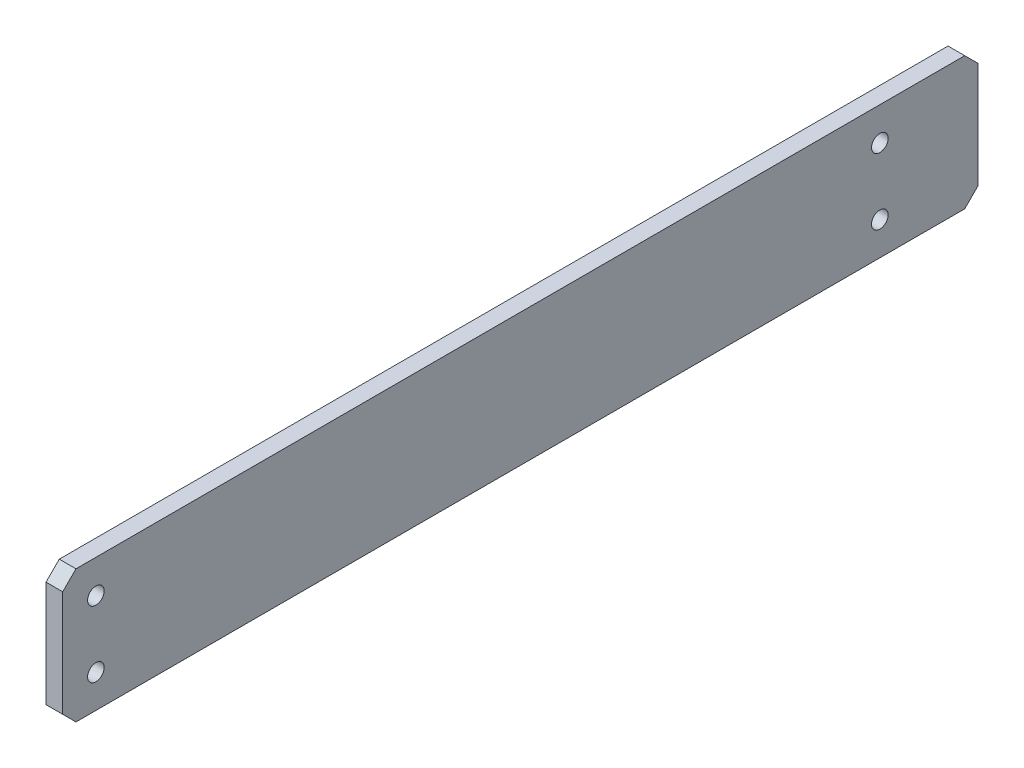
ISO-10303-21;
HEADER;
FILE_DESCRIPTION(('STEP AP214'),'2;1');
FILE_NAME('part.step','',(''),(''),'','','');
FILE_SCHEMA(('AUTOMOTIVE_DESIGN { 1 0 10303 214 1 1 1 1 }'));
ENDSEC;
DATA;
#1=APPLICATION_CONTEXT('core data for automotive mechanical design processes');
#2=APPLICATION_PROTOCOL_DEFINITION('international standard','automotive_design',2000,#1);
#3=PRODUCT_CONTEXT('',#1,'mechanical');
#4=PRODUCT('Part','Part','',(#3));
#5=PRODUCT_RELATED_PRODUCT_CATEGORY('part','',(#4));
#6=PRODUCT_DEFINITION_FORMATION('','',#4);
#7=PRODUCT_DEFINITION_CONTEXT('part definition',#1,'design');
#8=PRODUCT_DEFINITION('design','',#6,#7);
#9=PRODUCT_DEFINITION_SHAPE('','',#8);
#10=(LENGTH_UNIT() NAMED_UNIT(*) SI_UNIT(.MILLI.,.METRE.));
#11=(NAMED_UNIT(*) PLANE_ANGLE_UNIT() SI_UNIT($,.RADIAN.));
#12=(NAMED_UNIT(*) SI_UNIT($,.STERADIAN.) SOLID_ANGLE_UNIT());
#13=UNCERTAINTY_MEASURE_WITH_UNIT(LENGTH_MEASURE(1.E-05),#10,'distance_accuracy_value','');
#14=(GEOMETRIC_REPRESENTATION_CONTEXT(3) GLOBAL_UNCERTAINTY_ASSIGNED_CONTEXT((#13)) GLOBAL_UNIT_ASSIGNED_CONTEXT((#10,
#11,#12)) REPRESENTATION_CONTEXT('',''));
#15=CARTESIAN_POINT('',(0.,0.,0.));
#16=DIRECTION('',(0.,0.,1.));
#17=DIRECTION('',(1.,0.,0.));
#18=AXIS2_PLACEMENT_3D('',#15,#16,#17);
#19=CARTESIAN_POINT('',(5.588,0.,1.9558));
#20=DIRECTION('',(0.,-1.,0.));
#21=DIRECTION('',(-1.,0.,0.));
#22=AXIS2_PLACEMENT_3D('',#19,#20,#21);
#23=PLANE('',#22);
#24=DIRECTION('',(0.,0.,-1.));
#25=VECTOR('',#24,1.);
#26=CARTESIAN_POINT('',(7.9502,0.,9.906));
#27=LINE('',#26,#25);
#28=CARTESIAN_POINT('',(7.9502,0.,8.63599999999999));
#29=VERTEX_POINT('',#28);
#30=CARTESIAN_POINT('',(7.9502,0.,-76.454));
#31=VERTEX_POINT('',#30);
#32=EDGE_CURVE('E191',#29,#31,#27,.T.);
#33=ORIENTED_EDGE('',*,*,#32,.F.);
#34=DIRECTION('',(-1.,0.,0.));
#35=VECTOR('',#34,1.);
#36=CARTESIAN_POINT('',(5.588,0.,8.63599999999999));
#37=LINE('',#36,#35);
#38=CARTESIAN_POINT('',(6.35,0.,8.63599999999999));
#39=VERTEX_POINT('',#38);
#40=EDGE_CURVE('E202',#29,#39,#37,.T.);
#41=ORIENTED_EDGE('',*,*,#40,.T.);
#42=DIRECTION('',(0.,0.,-1.));
#43=VECTOR('',#42,1.);
#44=CARTESIAN_POINT('',(6.35,0.,9.906));
#45=LINE('',#44,#43);
#46=CARTESIAN_POINT('',(6.35,0.,-76.454));
#47=VERTEX_POINT('',#46);
#48=EDGE_CURVE('E176',#39,#47,#45,.T.);
#49=ORIENTED_EDGE('',*,*,#48,.T.);
#50=DIRECTION('',(1.,0.,0.));
#51=VECTOR('',#50,1.);
#52=CARTESIAN_POINT('',(5.588,0.,-76.454));
#53=LINE('',#52,#51);
#54=EDGE_CURVE('E189',#47,#31,#53,.T.);
#55=ORIENTED_EDGE('',*,*,#54,.T.);
#56=EDGE_LOOP('',(#33,#41,#49,#55));
#57=FACE_BOUND('',#56,.T.);
#58=ADVANCED_FACE('F49',(#57),#23,.T.);
#59=CARTESIAN_POINT('',(6.35,12.7,0.));
#60=DIRECTION('',(-1.,0.,0.));
#61=DIRECTION('',(0.,0.,1.));
#62=AXIS2_PLACEMENT_3D('',#59,#60,#61);
#63=PLANE('',#62);
#64=CARTESIAN_POINT('',(6.35,9.525,6.731));
#65=DIRECTION('',(-1.,0.,0.));
#66=DIRECTION('',(0.,0.,1.));
#67=AXIS2_PLACEMENT_3D('',#64,#65,#66);
#68=CIRCLE('',#67,0.793749999999999);
#69=CARTESIAN_POINT('',(6.35,9.525,7.52475));
#70=VERTEX_POINT('',#69);
#71=EDGE_CURVE('E177',#70,#70,#68,.T.);
#72=ORIENTED_EDGE('',*,*,#71,.F.);
#73=EDGE_LOOP('',(#72));
#74=FACE_BOUND('',#73,.T.);
#75=CARTESIAN_POINT('',(6.35,3.175,6.731));
#76=DIRECTION('',(-1.,0.,0.));
#77=DIRECTION('',(0.,0.,1.));
#78=AXIS2_PLACEMENT_3D('',#75,#76,#77);
#79=CIRCLE('',#78,0.793750000000001);
#80=CARTESIAN_POINT('',(6.35,3.175,7.52475));
#81=VERTEX_POINT('',#80);
#82=EDGE_CURVE('E181',#81,#81,#79,.T.);
#83=ORIENTED_EDGE('',*,*,#82,.F.);
#84=EDGE_LOOP('',(#83));
#85=FACE_BOUND('',#84,.T.);
#86=DIRECTION('',(0.,-1.,0.));
#87=VECTOR('',#86,1.);
#88=CARTESIAN_POINT('',(6.35,12.7,9.906));
#89=LINE('',#88,#87);
#90=CARTESIAN_POINT('',(6.35,11.43,9.906));
#91=VERTEX_POINT('',#90);
#92=CARTESIAN_POINT('',(6.35,1.27000000000001,9.906));
#93=VERTEX_POINT('',#92);
#94=EDGE_CURVE('E199',#91,#93,#89,.T.);
#95=ORIENTED_EDGE('',*,*,#94,.F.);
#96=DIRECTION('',(0.,0.707106781186548,-0.707106781186547));
#97=VECTOR('',#96,1.);
#98=CARTESIAN_POINT('',(6.35,12.065,9.271));
#99=LINE('',#98,#97);
#100=CARTESIAN_POINT('',(6.35,12.7,8.63599999999999));
#101=VERTEX_POINT('',#100);
#102=EDGE_CURVE('E72',#91,#101,#99,.T.);
#103=ORIENTED_EDGE('',*,*,#102,.T.);
#104=DIRECTION('',(0.,0.,-1.));
#105=VECTOR('',#104,1.);
#106=CARTESIAN_POINT('',(6.35,12.7,9.906));
#107=LINE('',#106,#105);
#108=CARTESIAN_POINT('',(6.35,12.7,-76.454));
#109=VERTEX_POINT('',#108);
#110=EDGE_CURVE('E121',#101,#109,#107,.T.);
#111=ORIENTED_EDGE('',*,*,#110,.T.);
#112=DIRECTION('',(0.,0.707106781186549,0.707106781186547));
#113=VECTOR('',#112,1.);
#114=CARTESIAN_POINT('',(6.35,50.927,-38.2270000000001));
#115=LINE('',#114,#113);
#116=CARTESIAN_POINT('',(6.35,11.43,-77.724));
#117=VERTEX_POINT('',#116);
#118=EDGE_CURVE('E137',#109,#117,#115,.F.);
#119=ORIENTED_EDGE('',*,*,#118,.T.);
#120=DIRECTION('',(0.,-1.,0.));
#121=VECTOR('',#120,1.);
#122=CARTESIAN_POINT('',(6.35,12.7,-77.724));
#123=LINE('',#122,#121);
#124=CARTESIAN_POINT('',(6.35,1.27000000000001,-77.724));
#125=VERTEX_POINT('',#124);
#126=EDGE_CURVE('E147',#117,#125,#123,.T.);
#127=ORIENTED_EDGE('',*,*,#126,.T.);
#128=DIRECTION('',(0.,0.707106781186549,-0.707106781186547));
#129=VECTOR('',#128,1.);
#130=CARTESIAN_POINT('',(6.35,-31.877,-44.5770000000001));
#131=LINE('',#130,#129);
#132=EDGE_CURVE('E140',#125,#47,#131,.F.);
#133=ORIENTED_EDGE('',*,*,#132,.T.);
#134=ORIENTED_EDGE('',*,*,#48,.F.);
#135=DIRECTION('',(0.,-0.707106781186548,-0.707106781186548));
#136=VECTOR('',#135,1.);
#137=CARTESIAN_POINT('',(6.35,6.985,15.621));
#138=LINE('',#137,#136);
#139=EDGE_CURVE('E206',#39,#93,#138,.F.);
#140=ORIENTED_EDGE('',*,*,#139,.T.);
#141=EDGE_LOOP('',(#95,#103,#111,#119,#127,#133,#134,#140));
#142=FACE_BOUND('',#141,.T.);
#143=CARTESIAN_POINT('',(6.35,9.525,-68.326));
#144=DIRECTION('',(-1.,0.,0.));
#145=DIRECTION('',(0.,0.,1.));
#146=AXIS2_PLACEMENT_3D('',#143,#144,#145);
#147=CIRCLE('',#146,0.793749999999993);
#148=CARTESIAN_POINT('',(6.35,9.525,-67.53225));
#149=VERTEX_POINT('',#148);
#150=EDGE_CURVE('E155',#149,#149,#147,.T.);
#151=ORIENTED_EDGE('',*,*,#150,.F.);
#152=EDGE_LOOP('',(#151));
#153=FACE_BOUND('',#152,.T.);
#154=CARTESIAN_POINT('',(6.35,3.175,-68.326));
#155=DIRECTION('',(-1.,0.,0.));
#156=DIRECTION('',(0.,0.,1.));
#157=AXIS2_PLACEMENT_3D('',#154,#155,#156);
#158=CIRCLE('',#157,0.793749999999993);
#159=CARTESIAN_POINT('',(6.35,3.175,-67.53225));
#160=VERTEX_POINT('',#159);
#161=EDGE_CURVE('E159',#160,#160,#158,.T.);
#162=ORIENTED_EDGE('',*,*,#161,.F.);
#163=EDGE_LOOP('',(#162));
#164=FACE_BOUND('',#163,.T.);
#165=ADVANCED_FACE('F51',(#74,#85,#142,#153,#164),#63,.T.);
#166=CARTESIAN_POINT('',(7.9502,12.7,9.906));
#167=DIRECTION('',(0.,0.,1.));
#168=DIRECTION('',(1.,0.,0.));
#169=AXIS2_PLACEMENT_3D('',#166,#167,#168);
#170=PLANE('',#169);
#171=DIRECTION('',(0.,-1.,0.));
#172=VECTOR('',#171,1.);
#173=CARTESIAN_POINT('',(7.9502,12.7,9.906));
#174=LINE('',#173,#172);
#175=CARTESIAN_POINT('',(7.9502,11.43,9.906));
#176=VERTEX_POINT('',#175);
#177=CARTESIAN_POINT('',(7.9502,1.27000000000001,9.906));
#178=VERTEX_POINT('',#177);
#179=EDGE_CURVE('E120',#176,#178,#174,.T.);
#180=ORIENTED_EDGE('',*,*,#179,.F.);
#181=DIRECTION('',(-1.,0.,0.));
#182=VECTOR('',#181,1.);
#183=CARTESIAN_POINT('',(6.35,11.43,9.906));
#184=LINE('',#183,#182);
#185=EDGE_CURVE('E217',#176,#91,#184,.T.);
#186=ORIENTED_EDGE('',*,*,#185,.T.);
#187=ORIENTED_EDGE('',*,*,#94,.T.);
#188=DIRECTION('',(1.,0.,0.));
#189=VECTOR('',#188,1.);
#190=CARTESIAN_POINT('',(7.9502,1.27000000000001,9.906));
#191=LINE('',#190,#189);
#192=EDGE_CURVE('E210',#93,#178,#191,.T.);
#193=ORIENTED_EDGE('',*,*,#192,.T.);
#194=EDGE_LOOP('',(#180,#186,#187,#193));
#195=FACE_BOUND('',#194,.T.);
#196=ADVANCED_FACE('F241',(#195),#170,.T.);
#197=CARTESIAN_POINT('',(7.9502,12.7,9.906));
#198=DIRECTION('',(-1.,0.,0.));
#199=DIRECTION('',(0.,0.,1.));
#200=AXIS2_PLACEMENT_3D('',#197,#198,#199);
#201=PLANE('',#200);
#202=CARTESIAN_POINT('',(7.9502,9.525,6.731));
#203=DIRECTION('',(-1.,0.,0.));
#204=DIRECTION('',(0.,0.,1.));
#205=AXIS2_PLACEMENT_3D('',#202,#203,#204);
#206=CIRCLE('',#205,0.793749999999999);
#207=CARTESIAN_POINT('',(7.9502,9.525,7.52475));
#208=VERTEX_POINT('',#207);
#209=EDGE_CURVE('E172',#208,#208,#206,.T.);
#210=ORIENTED_EDGE('',*,*,#209,.T.);
#211=EDGE_LOOP('',(#210));
#212=FACE_BOUND('',#211,.T.);
#213=CARTESIAN_POINT('',(7.9502,3.175,6.731));
#214=DIRECTION('',(-1.,0.,0.));
#215=DIRECTION('',(0.,0.,1.));
#216=AXIS2_PLACEMENT_3D('',#213,#214,#215);
#217=CIRCLE('',#216,0.793750000000001);
#218=CARTESIAN_POINT('',(7.9502,3.175,7.52475));
#219=VERTEX_POINT('',#218);
#220=EDGE_CURVE('E185',#219,#219,#217,.T.);
#221=ORIENTED_EDGE('',*,*,#220,.T.);
#222=EDGE_LOOP('',(#221));
#223=FACE_BOUND('',#222,.T.);
#224=DIRECTION('',(0.,0.,-1.));
#225=VECTOR('',#224,1.);
#226=CARTESIAN_POINT('',(7.9502,12.7,9.906));
#227=LINE('',#226,#225);
#228=CARTESIAN_POINT('',(7.9502,12.7,8.63599999999999));
#229=VERTEX_POINT('',#228);
#230=CARTESIAN_POINT('',(7.9502,12.7,-76.454));
#231=VERTEX_POINT('',#230);
#232=EDGE_CURVE('E111',#229,#231,#227,.T.);
#233=ORIENTED_EDGE('',*,*,#232,.F.);
#234=DIRECTION('',(0.,-0.707106781186548,0.707106781186547));
#235=VECTOR('',#234,1.);
#236=CARTESIAN_POINT('',(7.9502,11.43,9.906));
#237=LINE('',#236,#235);
#238=EDGE_CURVE('E12',#229,#176,#237,.T.);
#239=ORIENTED_EDGE('',*,*,#238,.T.);
#240=ORIENTED_EDGE('',*,*,#179,.T.);
#241=DIRECTION('',(0.,0.707106781186548,0.707106781186548));
#242=VECTOR('',#241,1.);
#243=CARTESIAN_POINT('',(7.9502,0.,8.63599999999999));
#244=LINE('',#243,#242);
#245=EDGE_CURVE('E214',#178,#29,#244,.F.);
#246=ORIENTED_EDGE('',*,*,#245,.T.);
#247=ORIENTED_EDGE('',*,*,#32,.T.);
#248=DIRECTION('',(0.,-0.707106781186549,0.707106781186547));
#249=VECTOR('',#248,1.);
#250=CARTESIAN_POINT('',(7.9502,0.,-76.454));
#251=LINE('',#250,#249);
#252=CARTESIAN_POINT('',(7.9502,1.27000000000001,-77.724));
#253=VERTEX_POINT('',#252);
#254=EDGE_CURVE('E133',#31,#253,#251,.F.);
#255=ORIENTED_EDGE('',*,*,#254,.T.);
#256=DIRECTION('',(0.,-1.,0.));
#257=VECTOR('',#256,1.);
#258=CARTESIAN_POINT('',(7.9502,12.7,-77.724));
#259=LINE('',#258,#257);
#260=CARTESIAN_POINT('',(7.9502,11.43,-77.724));
#261=VERTEX_POINT('',#260);
#262=EDGE_CURVE('E128',#261,#253,#259,.T.);
#263=ORIENTED_EDGE('',*,*,#262,.F.);
#264=DIRECTION('',(0.,-0.707106781186549,-0.707106781186547));
#265=VECTOR('',#264,1.);
#266=CARTESIAN_POINT('',(7.9502,11.43,-77.724));
#267=LINE('',#266,#265);
#268=EDGE_CURVE('E124',#261,#231,#267,.F.);
#269=ORIENTED_EDGE('',*,*,#268,.T.);
#270=EDGE_LOOP('',(#233,#239,#240,#246,#247,#255,#263,#269));
#271=FACE_BOUND('',#270,.T.);
#272=CARTESIAN_POINT('',(7.9502,9.525,-68.326));
#273=DIRECTION('',(-1.,0.,0.));
#274=DIRECTION('',(0.,0.,1.));
#275=AXIS2_PLACEMENT_3D('',#272,#273,#274);
#276=CIRCLE('',#275,0.793749999999993);
#277=CARTESIAN_POINT('',(7.9502,9.525,-67.53225));
#278=VERTEX_POINT('',#277);
#279=EDGE_CURVE('E139',#278,#278,#276,.T.);
#280=ORIENTED_EDGE('',*,*,#279,.T.);
#281=EDGE_LOOP('',(#280));
#282=FACE_BOUND('',#281,.T.);
#283=CARTESIAN_POINT('',(7.9502,3.175,-68.326));
#284=DIRECTION('',(-1.,0.,0.));
#285=DIRECTION('',(0.,0.,1.));
#286=AXIS2_PLACEMENT_3D('',#283,#284,#285);
#287=CIRCLE('',#286,0.793749999999993);
#288=CARTESIAN_POINT('',(7.9502,3.175,-67.53225));
#289=VERTEX_POINT('',#288);
#290=EDGE_CURVE('E134',#289,#289,#287,.T.);
#291=ORIENTED_EDGE('',*,*,#290,.T.);
#292=EDGE_LOOP('',(#291));
#293=FACE_BOUND('',#292,.T.);
#294=ADVANCED_FACE('F125',(#212,#223,#271,#282,#293),#201,.F.);
#295=CARTESIAN_POINT('',(5.588,12.7,4.318));
#296=DIRECTION('',(0.,-1.,0.));
#297=DIRECTION('',(0.,0.,1.));
#298=AXIS2_PLACEMENT_3D('',#295,#296,#297);
#299=PLANE('',#298);
#300=ORIENTED_EDGE('',*,*,#110,.F.);
#301=DIRECTION('',(1.,0.,0.));
#302=VECTOR('',#301,1.);
#303=CARTESIAN_POINT('',(7.9502,12.7,8.63599999999999));
#304=LINE('',#303,#302);
#305=EDGE_CURVE('E58',#101,#229,#304,.T.);
#306=ORIENTED_EDGE('',*,*,#305,.T.);
#307=ORIENTED_EDGE('',*,*,#232,.T.);
#308=DIRECTION('',(-1.,0.,0.));
#309=VECTOR('',#308,1.);
#310=CARTESIAN_POINT('',(5.588,12.7,-76.454));
#311=LINE('',#310,#309);
#312=EDGE_CURVE('E115',#231,#109,#311,.T.);
#313=ORIENTED_EDGE('',*,*,#312,.T.);
#314=EDGE_LOOP('',(#300,#306,#307,#313));
#315=FACE_BOUND('',#314,.T.);
#316=ADVANCED_FACE('F113',(#315),#299,.F.);
#317=CARTESIAN_POINT('',(7.9502,3.175,6.731));
#318=DIRECTION('',(-1.,0.,0.));
#319=DIRECTION('',(0.,0.,1.));
#320=AXIS2_PLACEMENT_3D('',#317,#318,#319);
#321=CYLINDRICAL_SURFACE('',#320,0.793750000000001);
#322=ORIENTED_EDGE('',*,*,#220,.F.);
#323=EDGE_LOOP('',(#322));
#324=FACE_BOUND('',#323,.T.);
#325=ORIENTED_EDGE('',*,*,#82,.T.);
#326=EDGE_LOOP('',(#325));
#327=FACE_BOUND('',#326,.T.);
#328=ADVANCED_FACE('F269',(#324,#327),#321,.F.);
#329=CARTESIAN_POINT('',(7.9502,9.525,6.731));
#330=DIRECTION('',(-1.,0.,0.));
#331=DIRECTION('',(0.,0.,1.));
#332=AXIS2_PLACEMENT_3D('',#329,#330,#331);
#333=CYLINDRICAL_SURFACE('',#332,0.793749999999999);
#334=ORIENTED_EDGE('',*,*,#209,.F.);
#335=EDGE_LOOP('',(#334));
#336=FACE_BOUND('',#335,.T.);
#337=ORIENTED_EDGE('',*,*,#71,.T.);
#338=EDGE_LOOP('',(#337));
#339=FACE_BOUND('',#338,.T.);
#340=ADVANCED_FACE('F265',(#336,#339),#333,.F.);
#341=CARTESIAN_POINT('',(5.588,0.,8.63599999999999));
#342=DIRECTION('',(0.,0.707106781186548,-0.707106781186548));
#343=DIRECTION('',(-1.,0.,0.));
#344=AXIS2_PLACEMENT_3D('',#341,#342,#343);
#345=PLANE('',#344);
#346=ORIENTED_EDGE('',*,*,#245,.F.);
#347=ORIENTED_EDGE('',*,*,#192,.F.);
#348=ORIENTED_EDGE('',*,*,#139,.F.);
#349=ORIENTED_EDGE('',*,*,#40,.F.);
#350=EDGE_LOOP('',(#346,#347,#348,#349));
#351=FACE_BOUND('',#350,.T.);
#352=ADVANCED_FACE('F268',(#351),#345,.F.);
#353=CARTESIAN_POINT('',(7.9502,11.43,9.906));
#354=DIRECTION('',(0.,0.707106781186547,0.707106781186548));
#355=DIRECTION('',(1.,0.,0.));
#356=AXIS2_PLACEMENT_3D('',#353,#354,#355);
#357=PLANE('',#356);
#358=ORIENTED_EDGE('',*,*,#238,.F.);
#359=ORIENTED_EDGE('',*,*,#305,.F.);
#360=ORIENTED_EDGE('',*,*,#102,.F.);
#361=ORIENTED_EDGE('',*,*,#185,.F.);
#362=EDGE_LOOP('',(#358,#359,#360,#361));
#363=FACE_BOUND('',#362,.T.);
#364=ADVANCED_FACE('F285',(#363),#357,.T.);
#365=CARTESIAN_POINT('',(5.588,0.,-76.454));
#366=DIRECTION('',(0.,0.707106781186547,0.707106781186549));
#367=DIRECTION('',(1.,0.,0.));
#368=AXIS2_PLACEMENT_3D('',#365,#366,#367);
#369=PLANE('',#368);
#370=ORIENTED_EDGE('',*,*,#132,.F.);
#371=DIRECTION('',(-1.,0.,0.));
#372=VECTOR('',#371,1.);
#373=CARTESIAN_POINT('',(6.35,1.27000000000001,-77.724));
#374=LINE('',#373,#372);
#375=EDGE_CURVE('E163',#253,#125,#374,.T.);
#376=ORIENTED_EDGE('',*,*,#375,.F.);
#377=ORIENTED_EDGE('',*,*,#254,.F.);
#378=ORIENTED_EDGE('',*,*,#54,.F.);
#379=EDGE_LOOP('',(#370,#376,#377,#378));
#380=FACE_BOUND('',#379,.T.);
#381=ADVANCED_FACE('F290',(#380),#369,.F.);
#382=CARTESIAN_POINT('',(6.35,12.7,-77.724));
#383=DIRECTION('',(0.,0.,-1.));
#384=DIRECTION('',(-1.,0.,0.));
#385=AXIS2_PLACEMENT_3D('',#382,#383,#384);
#386=PLANE('',#385);
#387=ORIENTED_EDGE('',*,*,#126,.F.);
#388=DIRECTION('',(1.,0.,0.));
#389=VECTOR('',#388,1.);
#390=CARTESIAN_POINT('',(6.35,11.43,-77.724));
#391=LINE('',#390,#389);
#392=EDGE_CURVE('E169',#117,#261,#391,.T.);
#393=ORIENTED_EDGE('',*,*,#392,.T.);
#394=ORIENTED_EDGE('',*,*,#262,.T.);
#395=ORIENTED_EDGE('',*,*,#375,.T.);
#396=EDGE_LOOP('',(#387,#393,#394,#395));
#397=FACE_BOUND('',#396,.T.);
#398=ADVANCED_FACE('F295',(#397),#386,.T.);
#399=CARTESIAN_POINT('',(6.35,11.43,-77.724));
#400=DIRECTION('',(0.,-0.707106781186547,0.707106781186549));
#401=DIRECTION('',(1.,0.,0.));
#402=AXIS2_PLACEMENT_3D('',#399,#400,#401);
#403=PLANE('',#402);
#404=ORIENTED_EDGE('',*,*,#118,.F.);
#405=ORIENTED_EDGE('',*,*,#312,.F.);
#406=ORIENTED_EDGE('',*,*,#268,.F.);
#407=ORIENTED_EDGE('',*,*,#392,.F.);
#408=EDGE_LOOP('',(#404,#405,#406,#407));
#409=FACE_BOUND('',#408,.T.);
#410=ADVANCED_FACE('F136',(#409),#403,.F.);
#411=CARTESIAN_POINT('',(7.9502,3.175,-68.326));
#412=DIRECTION('',(-1.,0.,0.));
#413=DIRECTION('',(0.,0.,1.));
#414=AXIS2_PLACEMENT_3D('',#411,#412,#413);
#415=CYLINDRICAL_SURFACE('',#414,0.793749999999993);
#416=CARTESIAN_POINT('',(7.9502,3.175,-67.53225));
#417=CARTESIAN_POINT('',(7.93353125,3.175,-67.53225));
#418=CARTESIAN_POINT('',(7.9168625,3.175,-67.53225));
#419=CARTESIAN_POINT('',(7.883525,3.175,-67.53225));
#420=CARTESIAN_POINT('',(7.86685625,3.175,-67.53225));
#421=CARTESIAN_POINT('',(7.83351875,3.175,-67.53225));
#422=CARTESIAN_POINT('',(7.81685,3.175,-67.53225));
#423=CARTESIAN_POINT('',(7.7835125,3.175,-67.53225));
#424=CARTESIAN_POINT('',(7.76684375,3.175,-67.53225));
#425=CARTESIAN_POINT('',(7.73350625,3.175,-67.53225));
#426=CARTESIAN_POINT('',(7.7168375,3.175,-67.53225));
#427=CARTESIAN_POINT('',(7.6835,3.175,-67.53225));
#428=CARTESIAN_POINT('',(7.66683125,3.175,-67.53225));
#429=CARTESIAN_POINT('',(7.63349375,3.175,-67.53225));
#430=CARTESIAN_POINT('',(7.616825,3.175,-67.53225));
#431=CARTESIAN_POINT('',(7.5834875,3.175,-67.53225));
#432=CARTESIAN_POINT('',(7.56681875,3.175,-67.53225));
#433=CARTESIAN_POINT('',(7.53348125,3.175,-67.53225));
#434=CARTESIAN_POINT('',(7.5168125,3.175,-67.53225));
#435=CARTESIAN_POINT('',(7.483475,3.175,-67.53225));
#436=CARTESIAN_POINT('',(7.46680625,3.175,-67.53225));
#437=CARTESIAN_POINT('',(7.43346875,3.175,-67.53225));
#438=CARTESIAN_POINT('',(7.4168,3.175,-67.53225));
#439=CARTESIAN_POINT('',(7.3834625,3.175,-67.53225));
#440=CARTESIAN_POINT('',(7.36679375,3.175,-67.53225));
#441=CARTESIAN_POINT('',(7.33345625,3.175,-67.53225));
#442=CARTESIAN_POINT('',(7.3167875,3.175,-67.53225));
#443=CARTESIAN_POINT('',(7.28345,3.175,-67.53225));
#444=CARTESIAN_POINT('',(7.26678125,3.175,-67.53225));
#445=CARTESIAN_POINT('',(7.23344375,3.175,-67.53225));
#446=CARTESIAN_POINT('',(7.216775,3.175,-67.53225));
#447=CARTESIAN_POINT('',(7.1834375,3.175,-67.53225));
#448=CARTESIAN_POINT('',(7.16676875,3.175,-67.53225));
#449=CARTESIAN_POINT('',(7.13343125,3.175,-67.53225));
#450=CARTESIAN_POINT('',(7.1167625,3.175,-67.53225));
#451=CARTESIAN_POINT('',(7.083425,3.175,-67.53225));
#452=CARTESIAN_POINT('',(7.06675625,3.175,-67.53225));
#453=CARTESIAN_POINT('',(7.03341875,3.175,-67.53225));
#454=CARTESIAN_POINT('',(7.01675,3.175,-67.53225));
#455=CARTESIAN_POINT('',(6.9834125,3.175,-67.53225));
#456=CARTESIAN_POINT('',(6.96674375,3.175,-67.53225));
#457=CARTESIAN_POINT('',(6.93340625,3.175,-67.53225));
#458=CARTESIAN_POINT('',(6.9167375,3.175,-67.53225));
#459=CARTESIAN_POINT('',(6.8834,3.175,-67.53225));
#460=CARTESIAN_POINT('',(6.86673125,3.175,-67.53225));
#461=CARTESIAN_POINT('',(6.83339375,3.175,-67.53225));
#462=CARTESIAN_POINT('',(6.816725,3.175,-67.53225));
#463=CARTESIAN_POINT('',(6.7833875,3.175,-67.53225));
#464=CARTESIAN_POINT('',(6.76671875,3.175,-67.53225));
#465=CARTESIAN_POINT('',(6.73338125,3.175,-67.53225));
#466=CARTESIAN_POINT('',(6.7167125,3.175,-67.53225));
#467=CARTESIAN_POINT('',(6.683375,3.175,-67.53225));
#468=CARTESIAN_POINT('',(6.66670625,3.175,-67.53225));
#469=CARTESIAN_POINT('',(6.63336875,3.175,-67.53225));
#470=CARTESIAN_POINT('',(6.6167,3.175,-67.53225));
#471=CARTESIAN_POINT('',(6.5833625,3.175,-67.53225));
#472=CARTESIAN_POINT('',(6.56669375,3.175,-67.53225));
#473=CARTESIAN_POINT('',(6.53335625,3.175,-67.53225));
#474=CARTESIAN_POINT('',(6.5166875,3.175,-67.53225));
#475=CARTESIAN_POINT('',(6.48335,3.175,-67.53225));
#476=CARTESIAN_POINT('',(6.46668125,3.175,-67.53225));
#477=CARTESIAN_POINT('',(6.43334375,3.175,-67.53225));
#478=CARTESIAN_POINT('',(6.416675,3.175,-67.53225));
#479=CARTESIAN_POINT('',(6.3833375,3.175,-67.53225));
#480=CARTESIAN_POINT('',(6.36666875,3.175,-67.53225));
#481=CARTESIAN_POINT('',(6.35,3.175,-67.53225));
#482=B_SPLINE_CURVE_WITH_KNOTS('',3,(#416,#417,#418,#419,#420,#421,#422,#423,#424,#425,#426,
#427,#428,#429,#430,#431,#432,#433,#434,#435,#436,#437,#438,#439,#440,#441,#442,#443,#444,#445,
#446,#447,#448,#449,#450,#451,#452,#453,#454,#455,#456,#457,#458,#459,#460,#461,#462,#463,#464,
#465,#466,#467,#468,#469,#470,#471,#472,#473,#474,#475,#476,#477,#478,#479,#480,#481),
.UNSPECIFIED.,.F.,.F.,(4,2,2,2,2,2,2,2,2,2,2,2,2,2,2,2,2,2,2,2,2,2,2,2,2,2,2,2,2,2,2,2,4),(0.,
0.0500062499999999,0.1000125,0.15001875,0.200025,0.250031249999999,0.300037499999999,
0.350043749999999,0.40005,0.45005625,0.5000625,0.55006875,0.600074999999999,0.65008125,
0.7000875,0.75009375,0.8001,0.85010625,0.9001125,0.95011875,1.000125,1.05013125,1.1001375,
1.15014375,1.20015,1.25015625,1.3001625,1.35016875,1.400175,1.45018125,1.5001875,1.55019375,
1.6002),.UNSPECIFIED.);
#483=EDGE_CURVE('BSEAM233',#289,#160,#482,.T.);
#484=ORIENTED_EDGE('',*,*,#290,.F.);
#485=ORIENTED_EDGE('',*,*,#161,.T.);
#486=ORIENTED_EDGE('',*,*,#483,.T.);
#487=ORIENTED_EDGE('',*,*,#483,.F.);
#488=EDGE_LOOP('',(#484,#486,#485,#487));
#489=FACE_BOUND('',#488,.T.);
#490=ADVANCED_FACE('F233',(#489),#415,.F.);
#491=CARTESIAN_POINT('',(7.9502,9.525,-68.326));
#492=DIRECTION('',(-1.,0.,0.));
#493=DIRECTION('',(0.,0.,1.));
#494=AXIS2_PLACEMENT_3D('',#491,#492,#493);
#495=CYLINDRICAL_SURFACE('',#494,0.793749999999993);
#496=CARTESIAN_POINT('',(7.9502,9.525,-67.53225));
#497=CARTESIAN_POINT('',(7.93353125,9.525,-67.53225));
#498=CARTESIAN_POINT('',(7.9168625,9.525,-67.53225));
#499=CARTESIAN_POINT('',(7.883525,9.525,-67.53225));
#500=CARTESIAN_POINT('',(7.86685625,9.525,-67.53225));
#501=CARTESIAN_POINT('',(7.83351875,9.525,-67.53225));
#502=CARTESIAN_POINT('',(7.81685,9.525,-67.53225));
#503=CARTESIAN_POINT('',(7.7835125,9.525,-67.53225));
#504=CARTESIAN_POINT('',(7.76684375,9.525,-67.53225));
#505=CARTESIAN_POINT('',(7.73350625,9.525,-67.53225));
#506=CARTESIAN_POINT('',(7.7168375,9.525,-67.53225));
#507=CARTESIAN_POINT('',(7.6835,9.525,-67.53225));
#508=CARTESIAN_POINT('',(7.66683125,9.525,-67.53225));
#509=CARTESIAN_POINT('',(7.63349375,9.525,-67.53225));
#510=CARTESIAN_POINT('',(7.616825,9.525,-67.53225));
#511=CARTESIAN_POINT('',(7.5834875,9.525,-67.53225));
#512=CARTESIAN_POINT('',(7.56681875,9.525,-67.53225));
#513=CARTESIAN_POINT('',(7.53348125,9.525,-67.53225));
#514=CARTESIAN_POINT('',(7.5168125,9.525,-67.53225));
#515=CARTESIAN_POINT('',(7.483475,9.525,-67.53225));
#516=CARTESIAN_POINT('',(7.46680625,9.525,-67.53225));
#517=CARTESIAN_POINT('',(7.43346875,9.525,-67.53225));
#518=CARTESIAN_POINT('',(7.4168,9.525,-67.53225));
#519=CARTESIAN_POINT('',(7.3834625,9.525,-67.53225));
#520=CARTESIAN_POINT('',(7.36679375,9.525,-67.53225));
#521=CARTESIAN_POINT('',(7.33345625,9.525,-67.53225));
#522=CARTESIAN_POINT('',(7.3167875,9.525,-67.53225));
#523=CARTESIAN_POINT('',(7.28345,9.525,-67.53225));
#524=CARTESIAN_POINT('',(7.26678125,9.525,-67.53225));
#525=CARTESIAN_POINT('',(7.23344375,9.525,-67.53225));
#526=CARTESIAN_POINT('',(7.216775,9.525,-67.53225));
#527=CARTESIAN_POINT('',(7.1834375,9.525,-67.53225));
#528=CARTESIAN_POINT('',(7.16676875,9.525,-67.53225));
#529=CARTESIAN_POINT('',(7.13343125,9.525,-67.53225));
#530=CARTESIAN_POINT('',(7.1167625,9.525,-67.53225));
#531=CARTESIAN_POINT('',(7.083425,9.525,-67.53225));
#532=CARTESIAN_POINT('',(7.06675625,9.525,-67.53225));
#533=CARTESIAN_POINT('',(7.03341875,9.525,-67.53225));
#534=CARTESIAN_POINT('',(7.01675,9.525,-67.53225));
#535=CARTESIAN_POINT('',(6.9834125,9.525,-67.53225));
#536=CARTESIAN_POINT('',(6.96674375,9.525,-67.53225));
#537=CARTESIAN_POINT('',(6.93340625,9.525,-67.53225));
#538=CARTESIAN_POINT('',(6.9167375,9.525,-67.53225));
#539=CARTESIAN_POINT('',(6.8834,9.525,-67.53225));
#540=CARTESIAN_POINT('',(6.86673125,9.525,-67.53225));
#541=CARTESIAN_POINT('',(6.83339375,9.525,-67.53225));
#542=CARTESIAN_POINT('',(6.816725,9.525,-67.53225));
#543=CARTESIAN_POINT('',(6.7833875,9.525,-67.53225));
#544=CARTESIAN_POINT('',(6.76671875,9.525,-67.53225));
#545=CARTESIAN_POINT('',(6.73338125,9.525,-67.53225));
#546=CARTESIAN_POINT('',(6.7167125,9.525,-67.53225));
#547=CARTESIAN_POINT('',(6.683375,9.525,-67.53225));
#548=CARTESIAN_POINT('',(6.66670625,9.525,-67.53225));
#549=CARTESIAN_POINT('',(6.63336875,9.525,-67.53225));
#550=CARTESIAN_POINT('',(6.6167,9.525,-67.53225));
#551=CARTESIAN_POINT('',(6.5833625,9.525,-67.53225));
#552=CARTESIAN_POINT('',(6.56669375,9.525,-67.53225));
#553=CARTESIAN_POINT('',(6.53335625,9.525,-67.53225));
#554=CARTESIAN_POINT('',(6.5166875,9.525,-67.53225));
#555=CARTESIAN_POINT('',(6.48335,9.525,-67.53225));
#556=CARTESIAN_POINT('',(6.46668125,9.525,-67.53225));
#557=CARTESIAN_POINT('',(6.43334375,9.525,-67.53225));
#558=CARTESIAN_POINT('',(6.416675,9.525,-67.53225));
#559=CARTESIAN_POINT('',(6.3833375,9.525,-67.53225));
#560=CARTESIAN_POINT('',(6.36666875,9.525,-67.53225));
#561=CARTESIAN_POINT('',(6.35,9.525,-67.53225));
#562=B_SPLINE_CURVE_WITH_KNOTS('',3,(#496,#497,#498,#499,#500,#501,#502,#503,#504,#505,#506,
#507,#508,#509,#510,#511,#512,#513,#514,#515,#516,#517,#518,#519,#520,#521,#522,#523,#524,#525,
#526,#527,#528,#529,#530,#531,#532,#533,#534,#535,#536,#537,#538,#539,#540,#541,#542,#543,#544,
#545,#546,#547,#548,#549,#550,#551,#552,#553,#554,#555,#556,#557,#558,#559,#560,#561),
.UNSPECIFIED.,.F.,.F.,(4,2,2,2,2,2,2,2,2,2,2,2,2,2,2,2,2,2,2,2,2,2,2,2,2,2,2,2,2,2,2,2,4),(0.,
0.0500062499999999,0.1000125,0.15001875,0.200025,0.250031249999999,0.300037499999999,
0.350043749999999,0.40005,0.45005625,0.5000625,0.55006875,0.600074999999999,0.65008125,
0.7000875,0.75009375,0.8001,0.85010625,0.9001125,0.95011875,1.000125,1.05013125,1.1001375,
1.15014375,1.20015,1.25015625,1.3001625,1.35016875,1.400175,1.45018125,1.5001875,1.55019375,
1.6002),.UNSPECIFIED.);
#563=EDGE_CURVE('BSEAM236',#278,#149,#562,.T.);
#564=ORIENTED_EDGE('',*,*,#279,.F.);
#565=ORIENTED_EDGE('',*,*,#150,.T.);
#566=ORIENTED_EDGE('',*,*,#563,.T.);
#567=ORIENTED_EDGE('',*,*,#563,.F.);
#568=EDGE_LOOP('',(#564,#566,#565,#567));
#569=FACE_BOUND('',#568,.T.);
#570=ADVANCED_FACE('F236',(#569),#495,.F.);
#571=CLOSED_SHELL('',(#58,#165,#196,#294,#316,#328,#340,#352,#364,#381,#398,#410,#490,#570));
#572=MANIFOLD_SOLID_BREP('B2',#571);
#573=ADVANCED_BREP_SHAPE_REPRESENTATION('',(#18,#572),#14);
#574=SHAPE_DEFINITION_REPRESENTATION(#9,#573);
ENDSEC;
END-ISO-10303-21;
